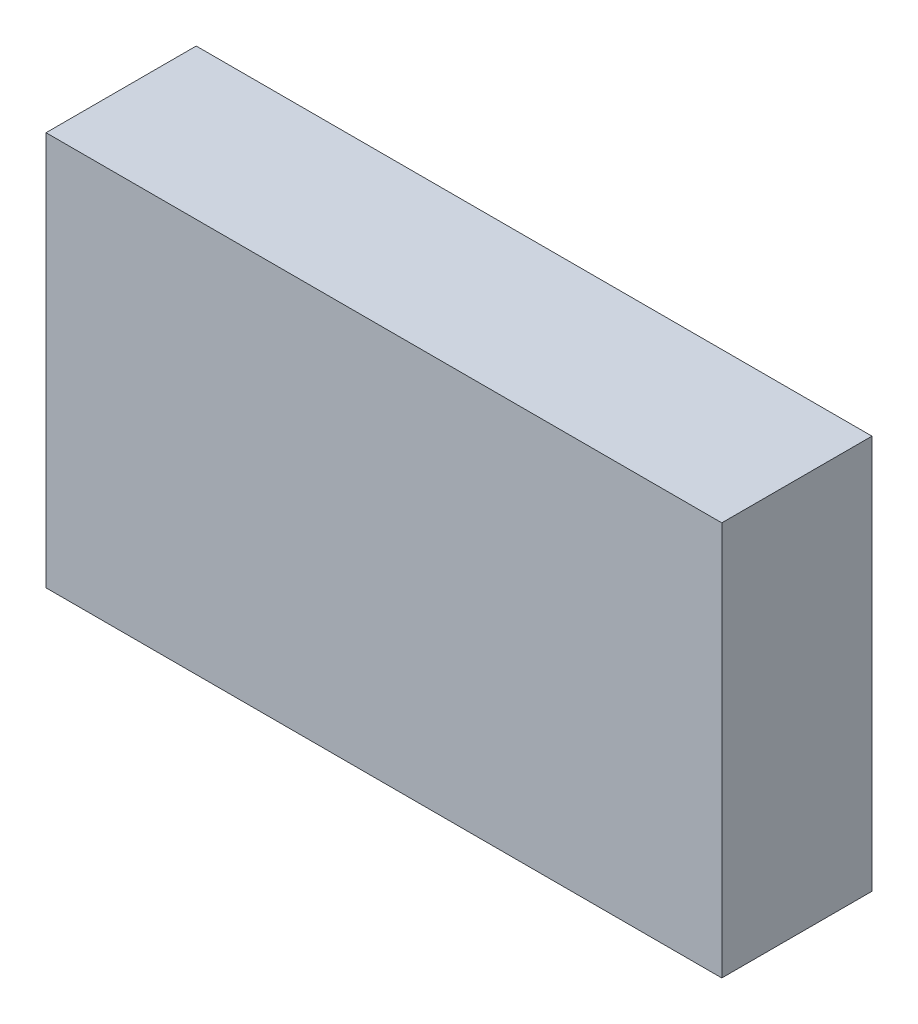
ISO-10303-21;
HEADER;
FILE_DESCRIPTION(('STEP AP214'),'2;1');
FILE_NAME('part.step','',(''),(''),'','','');
FILE_SCHEMA(('AUTOMOTIVE_DESIGN { 1 0 10303 214 1 1 1 1 }'));
ENDSEC;
DATA;
#1=APPLICATION_CONTEXT('core data for automotive mechanical design processes');
#2=APPLICATION_PROTOCOL_DEFINITION('international standard','automotive_design',2000,#1);
#3=PRODUCT_CONTEXT('',#1,'mechanical');
#4=PRODUCT('Part','Part','',(#3));
#5=PRODUCT_RELATED_PRODUCT_CATEGORY('part','',(#4));
#6=PRODUCT_DEFINITION_FORMATION('','',#4);
#7=PRODUCT_DEFINITION_CONTEXT('part definition',#1,'design');
#8=PRODUCT_DEFINITION('design','',#6,#7);
#9=PRODUCT_DEFINITION_SHAPE('','',#8);
#10=(LENGTH_UNIT() NAMED_UNIT(*) SI_UNIT(.MILLI.,.METRE.));
#11=(NAMED_UNIT(*) PLANE_ANGLE_UNIT() SI_UNIT($,.RADIAN.));
#12=(NAMED_UNIT(*) SI_UNIT($,.STERADIAN.) SOLID_ANGLE_UNIT());
#13=UNCERTAINTY_MEASURE_WITH_UNIT(LENGTH_MEASURE(1.E-05),#10,'distance_accuracy_value','');
#14=(GEOMETRIC_REPRESENTATION_CONTEXT(3) GLOBAL_UNCERTAINTY_ASSIGNED_CONTEXT((#13)) GLOBAL_UNIT_ASSIGNED_CONTEXT((#10,
#11,#12)) REPRESENTATION_CONTEXT('',''));
#15=CARTESIAN_POINT('',(0.,0.,0.));
#16=DIRECTION('',(0.,0.,1.));
#17=DIRECTION('',(1.,0.,0.));
#18=AXIS2_PLACEMENT_3D('',#15,#16,#17);
#19=CARTESIAN_POINT('',(0.,0.,0.8));
#20=DIRECTION('',(0.,0.,1.));
#21=DIRECTION('',(1.,0.,0.));
#22=AXIS2_PLACEMENT_3D('',#19,#20,#21);
#23=PLANE('',#22);
#24=DIRECTION('',(1.,0.,0.));
#25=VECTOR('',#24,1.);
#26=CARTESIAN_POINT('',(-1.79995,-1.04995,0.8));
#27=LINE('',#26,#25);
#28=CARTESIAN_POINT('',(-1.79995,-1.04995,0.8));
#29=VERTEX_POINT('',#28);
#30=CARTESIAN_POINT('',(1.79995,-1.04995,0.8));
#31=VERTEX_POINT('',#30);
#32=EDGE_CURVE('E79',#29,#31,#27,.T.);
#33=ORIENTED_EDGE('',*,*,#32,.T.);
#34=DIRECTION('',(0.,1.,0.));
#35=VECTOR('',#34,1.);
#36=CARTESIAN_POINT('',(1.79995,-1.04995,0.8));
#37=LINE('',#36,#35);
#38=CARTESIAN_POINT('',(1.79995,1.04995,0.8));
#39=VERTEX_POINT('',#38);
#40=EDGE_CURVE('E85',#31,#39,#37,.T.);
#41=ORIENTED_EDGE('',*,*,#40,.T.);
#42=DIRECTION('',(-1.,0.,0.));
#43=VECTOR('',#42,1.);
#44=CARTESIAN_POINT('',(1.79995,1.04995,0.8));
#45=LINE('',#44,#43);
#46=CARTESIAN_POINT('',(-1.79995,1.04995,0.8));
#47=VERTEX_POINT('',#46);
#48=EDGE_CURVE('E20',#39,#47,#45,.T.);
#49=ORIENTED_EDGE('',*,*,#48,.T.);
#50=DIRECTION('',(0.,-1.,0.));
#51=VECTOR('',#50,1.);
#52=CARTESIAN_POINT('',(-1.79995,1.04995,0.8));
#53=LINE('',#52,#51);
#54=EDGE_CURVE('E11',#47,#29,#53,.T.);
#55=ORIENTED_EDGE('',*,*,#54,.T.);
#56=EDGE_LOOP('',(#33,#41,#49,#55));
#57=FACE_BOUND('',#56,.T.);
#58=ADVANCED_FACE('F16',(#57),#23,.T.);
#59=CARTESIAN_POINT('',(0.,0.,0.));
#60=DIRECTION('',(0.,0.,1.));
#61=DIRECTION('',(1.,0.,0.));
#62=AXIS2_PLACEMENT_3D('',#59,#60,#61);
#63=PLANE('',#62);
#64=DIRECTION('',(1.,0.,0.));
#65=VECTOR('',#64,1.);
#66=CARTESIAN_POINT('',(-1.79995,-1.04995,0.));
#67=LINE('',#66,#65);
#68=CARTESIAN_POINT('',(-1.79995,-1.04995,0.));
#69=VERTEX_POINT('',#68);
#70=CARTESIAN_POINT('',(1.79995,-1.04995,0.));
#71=VERTEX_POINT('',#70);
#72=EDGE_CURVE('E70',#69,#71,#67,.T.);
#73=ORIENTED_EDGE('',*,*,#72,.F.);
#74=DIRECTION('',(0.,-1.,0.));
#75=VECTOR('',#74,1.);
#76=CARTESIAN_POINT('',(-1.79995,1.04995,0.));
#77=LINE('',#76,#75);
#78=CARTESIAN_POINT('',(-1.79995,1.04995,0.));
#79=VERTEX_POINT('',#78);
#80=EDGE_CURVE('E27',#79,#69,#77,.T.);
#81=ORIENTED_EDGE('',*,*,#80,.F.);
#82=DIRECTION('',(-1.,0.,0.));
#83=VECTOR('',#82,1.);
#84=CARTESIAN_POINT('',(1.79995,1.04995,0.));
#85=LINE('',#84,#83);
#86=CARTESIAN_POINT('',(1.79995,1.04995,0.));
#87=VERTEX_POINT('',#86);
#88=EDGE_CURVE('E73',#87,#79,#85,.T.);
#89=ORIENTED_EDGE('',*,*,#88,.F.);
#90=DIRECTION('',(0.,1.,0.));
#91=VECTOR('',#90,1.);
#92=CARTESIAN_POINT('',(1.79995,-1.04995,0.));
#93=LINE('',#92,#91);
#94=EDGE_CURVE('E66',#71,#87,#93,.T.);
#95=ORIENTED_EDGE('',*,*,#94,.F.);
#96=EDGE_LOOP('',(#73,#81,#89,#95));
#97=FACE_BOUND('',#96,.T.);
#98=ADVANCED_FACE('F68',(#97),#63,.F.);
#99=CARTESIAN_POINT('',(-1.79995,1.04995,0.));
#100=DIRECTION('',(1.,0.,0.));
#101=DIRECTION('',(0.,1.,0.));
#102=AXIS2_PLACEMENT_3D('',#99,#100,#101);
#103=PLANE('',#102);
#104=DIRECTION('',(0.,0.,1.));
#105=VECTOR('',#104,1.);
#106=CARTESIAN_POINT('',(-1.79995,1.04995,0.));
#107=LINE('',#106,#105);
#108=EDGE_CURVE('E103',#79,#47,#107,.T.);
#109=ORIENTED_EDGE('',*,*,#108,.F.);
#110=ORIENTED_EDGE('',*,*,#80,.T.);
#111=DIRECTION('',(0.,0.,1.));
#112=VECTOR('',#111,1.);
#113=CARTESIAN_POINT('',(-1.79995,-1.04995,0.));
#114=LINE('',#113,#112);
#115=EDGE_CURVE('E92',#69,#29,#114,.T.);
#116=ORIENTED_EDGE('',*,*,#115,.T.);
#117=ORIENTED_EDGE('',*,*,#54,.F.);
#118=EDGE_LOOP('',(#109,#110,#116,#117));
#119=FACE_BOUND('',#118,.T.);
#120=ADVANCED_FACE('F115',(#119),#103,.F.);
#121=CARTESIAN_POINT('',(1.79995,1.04995,0.));
#122=DIRECTION('',(0.,-1.,0.));
#123=DIRECTION('',(0.,0.,-1.));
#124=AXIS2_PLACEMENT_3D('',#121,#122,#123);
#125=PLANE('',#124);
#126=DIRECTION('',(0.,0.,1.));
#127=VECTOR('',#126,1.);
#128=CARTESIAN_POINT('',(1.79995,1.04995,0.));
#129=LINE('',#128,#127);
#130=EDGE_CURVE('E78',#87,#39,#129,.T.);
#131=ORIENTED_EDGE('',*,*,#130,.F.);
#132=ORIENTED_EDGE('',*,*,#88,.T.);
#133=ORIENTED_EDGE('',*,*,#108,.T.);
#134=ORIENTED_EDGE('',*,*,#48,.F.);
#135=EDGE_LOOP('',(#131,#132,#133,#134));
#136=FACE_BOUND('',#135,.T.);
#137=ADVANCED_FACE('F18',(#136),#125,.F.);
#138=CARTESIAN_POINT('',(1.79995,-1.04995,0.));
#139=DIRECTION('',(-1.,0.,0.));
#140=DIRECTION('',(0.,0.,1.));
#141=AXIS2_PLACEMENT_3D('',#138,#139,#140);
#142=PLANE('',#141);
#143=DIRECTION('',(0.,0.,1.));
#144=VECTOR('',#143,1.);
#145=CARTESIAN_POINT('',(1.79995,-1.04995,0.));
#146=LINE('',#145,#144);
#147=EDGE_CURVE('E82',#71,#31,#146,.T.);
#148=ORIENTED_EDGE('',*,*,#147,.F.);
#149=ORIENTED_EDGE('',*,*,#94,.T.);
#150=ORIENTED_EDGE('',*,*,#130,.T.);
#151=ORIENTED_EDGE('',*,*,#40,.F.);
#152=EDGE_LOOP('',(#148,#149,#150,#151));
#153=FACE_BOUND('',#152,.T.);
#154=ADVANCED_FACE('F83',(#153),#142,.F.);
#155=CARTESIAN_POINT('',(-1.79995,-1.04995,0.));
#156=DIRECTION('',(0.,1.,0.));
#157=DIRECTION('',(1.,0.,0.));
#158=AXIS2_PLACEMENT_3D('',#155,#156,#157);
#159=PLANE('',#158);
#160=ORIENTED_EDGE('',*,*,#115,.F.);
#161=ORIENTED_EDGE('',*,*,#72,.T.);
#162=ORIENTED_EDGE('',*,*,#147,.T.);
#163=ORIENTED_EDGE('',*,*,#32,.F.);
#164=EDGE_LOOP('',(#160,#161,#162,#163));
#165=FACE_BOUND('',#164,.T.);
#166=ADVANCED_FACE('F91',(#165),#159,.F.);
#167=CLOSED_SHELL('',(#58,#98,#120,#137,#154,#166));
#168=MANIFOLD_SOLID_BREP('B1',#167);
#169=ADVANCED_BREP_SHAPE_REPRESENTATION('',(#18,#168),#14);
#170=SHAPE_DEFINITION_REPRESENTATION(#9,#169);
ENDSEC;
END-ISO-10303-21;
